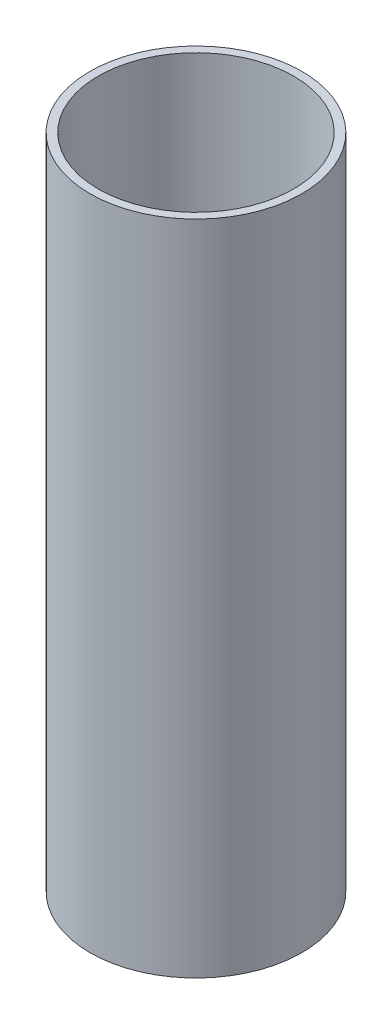
ISO-10303-21;
HEADER;
FILE_DESCRIPTION(('STEP AP214'),'2;1');
FILE_NAME('part.step','',(''),(''),'','','');
FILE_SCHEMA(('AUTOMOTIVE_DESIGN { 1 0 10303 214 1 1 1 1 }'));
ENDSEC;
DATA;
#1=APPLICATION_CONTEXT('core data for automotive mechanical design processes');
#2=APPLICATION_PROTOCOL_DEFINITION('international standard','automotive_design',2000,#1);
#3=PRODUCT_CONTEXT('',#1,'mechanical');
#4=PRODUCT('Part','Part','',(#3));
#5=PRODUCT_RELATED_PRODUCT_CATEGORY('part','',(#4));
#6=PRODUCT_DEFINITION_FORMATION('','',#4);
#7=PRODUCT_DEFINITION_CONTEXT('part definition',#1,'design');
#8=PRODUCT_DEFINITION('design','',#6,#7);
#9=PRODUCT_DEFINITION_SHAPE('','',#8);
#10=(LENGTH_UNIT() NAMED_UNIT(*) SI_UNIT(.MILLI.,.METRE.));
#11=(NAMED_UNIT(*) PLANE_ANGLE_UNIT() SI_UNIT($,.RADIAN.));
#12=(NAMED_UNIT(*) SI_UNIT($,.STERADIAN.) SOLID_ANGLE_UNIT());
#13=UNCERTAINTY_MEASURE_WITH_UNIT(LENGTH_MEASURE(1.E-05),#10,'distance_accuracy_value','');
#14=(GEOMETRIC_REPRESENTATION_CONTEXT(3) GLOBAL_UNCERTAINTY_ASSIGNED_CONTEXT((#13)) GLOBAL_UNIT_ASSIGNED_CONTEXT((#10,
#11,#12)) REPRESENTATION_CONTEXT('',''));
#15=CARTESIAN_POINT('',(0.,0.,0.));
#16=DIRECTION('',(0.,0.,1.));
#17=DIRECTION('',(1.,0.,0.));
#18=AXIS2_PLACEMENT_3D('',#15,#16,#17);
#19=CARTESIAN_POINT('',(0.,60.,0.));
#20=DIRECTION('',(0.,1.,0.));
#21=DIRECTION('',(0.,0.,1.));
#22=AXIS2_PLACEMENT_3D('',#19,#20,#21);
#23=PLANE('',#22);
#24=CARTESIAN_POINT('',(0.,60.,0.));
#25=DIRECTION('',(0.,1.,0.));
#26=DIRECTION('',(0.,0.,1.));
#27=AXIS2_PLACEMENT_3D('',#24,#25,#26);
#28=CIRCLE('',#27,19.35);
#29=CARTESIAN_POINT('',(0.,60.,19.35));
#30=VERTEX_POINT('',#29);
#31=EDGE_CURVE('E10',#30,#30,#28,.T.);
#32=ORIENTED_EDGE('',*,*,#31,.T.);
#33=EDGE_LOOP('',(#32));
#34=FACE_BOUND('',#33,.T.);
#35=CARTESIAN_POINT('',(0.,60.,0.));
#36=DIRECTION('',(0.,1.,0.));
#37=DIRECTION('',(0.,0.,1.));
#38=AXIS2_PLACEMENT_3D('',#35,#36,#37);
#39=CIRCLE('',#38,17.85);
#40=CARTESIAN_POINT('',(0.,60.,17.85));
#41=VERTEX_POINT('',#40);
#42=EDGE_CURVE('E50',#41,#41,#39,.T.);
#43=ORIENTED_EDGE('',*,*,#42,.F.);
#44=EDGE_LOOP('',(#43));
#45=FACE_BOUND('',#44,.T.);
#46=ADVANCED_FACE('F37',(#34,#45),#23,.T.);
#47=CARTESIAN_POINT('',(0.,-60.,0.));
#48=DIRECTION('',(0.,1.,0.));
#49=DIRECTION('',(0.,0.,1.));
#50=AXIS2_PLACEMENT_3D('',#47,#48,#49);
#51=PLANE('',#50);
#52=CARTESIAN_POINT('',(0.,-60.,0.));
#53=DIRECTION('',(0.,1.,0.));
#54=DIRECTION('',(0.,0.,1.));
#55=AXIS2_PLACEMENT_3D('',#52,#53,#54);
#56=CIRCLE('',#55,19.35);
#57=CARTESIAN_POINT('',(0.,-60.,19.35));
#58=VERTEX_POINT('',#57);
#59=EDGE_CURVE('E41',#58,#58,#56,.T.);
#60=ORIENTED_EDGE('',*,*,#59,.F.);
#61=EDGE_LOOP('',(#60));
#62=FACE_BOUND('',#61,.T.);
#63=CARTESIAN_POINT('',(0.,-60.,0.));
#64=DIRECTION('',(0.,1.,0.));
#65=DIRECTION('',(0.,0.,1.));
#66=AXIS2_PLACEMENT_3D('',#63,#64,#65);
#67=CIRCLE('',#66,17.85);
#68=CARTESIAN_POINT('',(0.,-60.,17.85));
#69=VERTEX_POINT('',#68);
#70=EDGE_CURVE('E52',#69,#69,#67,.T.);
#71=ORIENTED_EDGE('',*,*,#70,.T.);
#72=EDGE_LOOP('',(#71));
#73=FACE_BOUND('',#72,.T.);
#74=ADVANCED_FACE('F64',(#62,#73),#51,.F.);
#75=CARTESIAN_POINT('',(0.,60.,0.));
#76=DIRECTION('',(0.,-1.,0.));
#77=DIRECTION('',(0.,0.,-1.));
#78=AXIS2_PLACEMENT_3D('',#75,#76,#77);
#79=CYLINDRICAL_SURFACE('',#78,19.35);
#80=ORIENTED_EDGE('',*,*,#31,.F.);
#81=EDGE_LOOP('',(#80));
#82=FACE_BOUND('',#81,.T.);
#83=ORIENTED_EDGE('',*,*,#59,.T.);
#84=EDGE_LOOP('',(#83));
#85=FACE_BOUND('',#84,.T.);
#86=ADVANCED_FACE('F39',(#82,#85),#79,.T.);
#87=CARTESIAN_POINT('',(0.,60.,0.));
#88=DIRECTION('',(0.,-1.,0.));
#89=DIRECTION('',(0.,0.,-1.));
#90=AXIS2_PLACEMENT_3D('',#87,#88,#89);
#91=CYLINDRICAL_SURFACE('',#90,17.85);
#92=ORIENTED_EDGE('',*,*,#42,.T.);
#93=EDGE_LOOP('',(#92));
#94=FACE_BOUND('',#93,.T.);
#95=ORIENTED_EDGE('',*,*,#70,.F.);
#96=EDGE_LOOP('',(#95));
#97=FACE_BOUND('',#96,.T.);
#98=ADVANCED_FACE('F60',(#94,#97),#91,.F.);
#99=CLOSED_SHELL('',(#46,#74,#86,#98));
#100=MANIFOLD_SOLID_BREP('B2',#99);
#101=ADVANCED_BREP_SHAPE_REPRESENTATION('',(#18,#100),#14);
#102=SHAPE_DEFINITION_REPRESENTATION(#9,#101);
ENDSEC;
END-ISO-10303-21;
